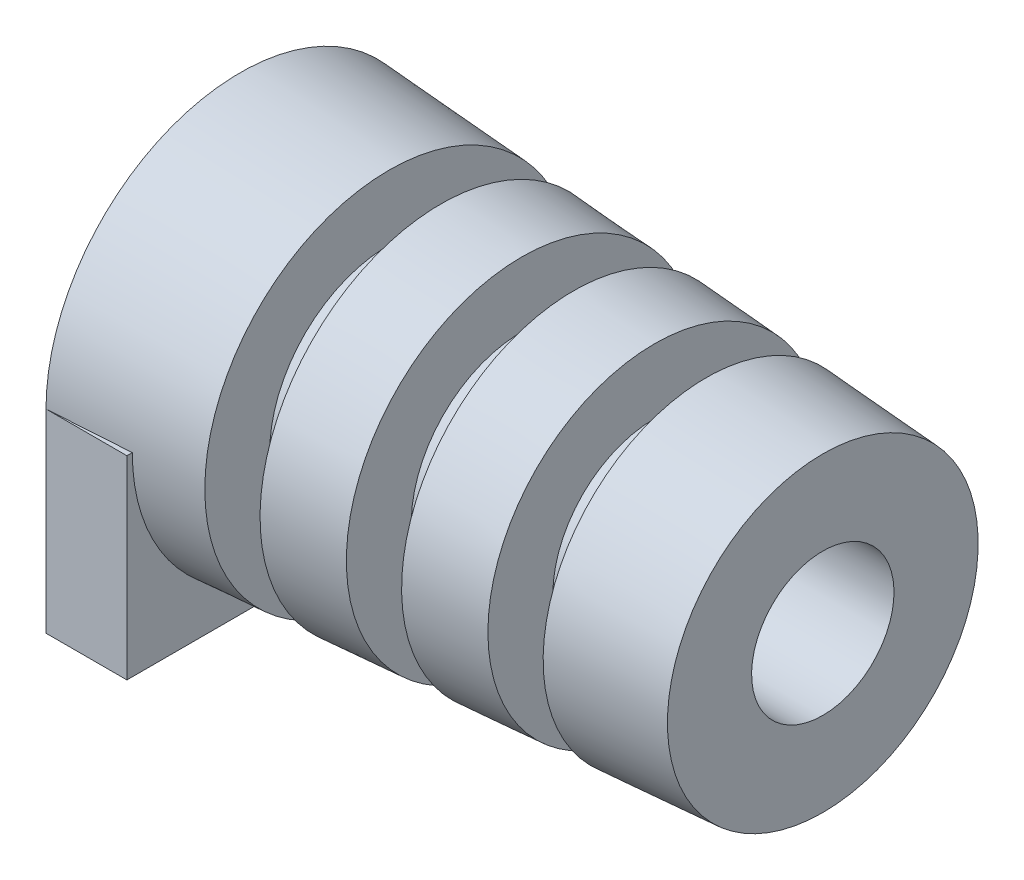
ISO-10303-21;
HEADER;
FILE_DESCRIPTION(('STEP AP214'),'2;1');
FILE_NAME('part.step','',(''),(''),'','','');
FILE_SCHEMA(('AUTOMOTIVE_DESIGN { 1 0 10303 214 1 1 1 1 }'));
ENDSEC;
DATA;
#1=APPLICATION_CONTEXT('core data for automotive mechanical design processes');
#2=APPLICATION_PROTOCOL_DEFINITION('international standard','automotive_design',2000,#1);
#3=PRODUCT_CONTEXT('',#1,'mechanical');
#4=PRODUCT('Part','Part','',(#3));
#5=PRODUCT_RELATED_PRODUCT_CATEGORY('part','',(#4));
#6=PRODUCT_DEFINITION_FORMATION('','',#4);
#7=PRODUCT_DEFINITION_CONTEXT('part definition',#1,'design');
#8=PRODUCT_DEFINITION('design','',#6,#7);
#9=PRODUCT_DEFINITION_SHAPE('','',#8);
#10=(LENGTH_UNIT() NAMED_UNIT(*) SI_UNIT(.MILLI.,.METRE.));
#11=(NAMED_UNIT(*) PLANE_ANGLE_UNIT() SI_UNIT($,.RADIAN.));
#12=(NAMED_UNIT(*) SI_UNIT($,.STERADIAN.) SOLID_ANGLE_UNIT());
#13=UNCERTAINTY_MEASURE_WITH_UNIT(LENGTH_MEASURE(1.E-05),#10,'distance_accuracy_value','');
#14=(GEOMETRIC_REPRESENTATION_CONTEXT(3) GLOBAL_UNCERTAINTY_ASSIGNED_CONTEXT((#13)) GLOBAL_UNIT_ASSIGNED_CONTEXT((#10,
#11,#12)) REPRESENTATION_CONTEXT('',''));
#15=CARTESIAN_POINT('',(0.,0.,0.));
#16=DIRECTION('',(0.,0.,1.));
#17=DIRECTION('',(1.,0.,0.));
#18=AXIS2_PLACEMENT_3D('',#15,#16,#17);
#19=CARTESIAN_POINT('',(6.10400233391438,-1.84629635361384,50.4016402272596));
#20=DIRECTION('',(1.,0.,0.));
#21=DIRECTION('',(0.,1.,0.));
#22=AXIS2_PLACEMENT_3D('',#19,#20,#21);
#23=PLANE('',#22);
#24=CARTESIAN_POINT('',(6.10400233391438,5.3842369797195,50.4016402272596));
#25=DIRECTION('',(-1.,0.,0.));
#26=DIRECTION('',(0.,-1.,0.));
#27=AXIS2_PLACEMENT_3D('',#24,#25,#26);
#28=CIRCLE('',#27,4.68508525098379);
#29=CARTESIAN_POINT('',(6.10400233391438,0.699151728735705,50.4016402272596));
#30=VERTEX_POINT('',#29);
#31=EDGE_CURVE('E221',#30,#30,#28,.T.);
#32=ORIENTED_EDGE('',*,*,#31,.T.);
#33=EDGE_LOOP('',(#32));
#34=FACE_BOUND('',#33,.T.);
#35=CARTESIAN_POINT('',(6.10400233391437,5.3842369797195,50.4016402272596));
#36=DIRECTION('',(-1.,0.,0.));
#37=DIRECTION('',(0.,-1.,0.));
#38=AXIS2_PLACEMENT_3D('',#35,#36,#37);
#39=CIRCLE('',#38,7.2307234377216);
#40=CARTESIAN_POINT('',(6.10400233391437,-1.84648645800211,50.4016402272596));
#41=VERTEX_POINT('',#40);
#42=EDGE_CURVE('E266',#41,#41,#39,.T.);
#43=ORIENTED_EDGE('',*,*,#42,.F.);
#44=EDGE_LOOP('',(#43));
#45=FACE_BOUND('',#44,.T.);
#46=ADVANCED_FACE('F38',(#34,#45),#23,.T.);
#47=CARTESIAN_POINT('',(6.10400233391437,5.3842369797195,50.4016402272596));
#48=DIRECTION('',(-1.,0.,0.));
#49=DIRECTION('',(0.,-1.,0.));
#50=AXIS2_PLACEMENT_3D('',#47,#48,#49);
#51=CONICAL_SURFACE('',#50,7.2307234377216,0.0665681637758238);
#52=CARTESIAN_POINT('',(3.43659593391437,5.3842369797195,50.4016402272596));
#53=DIRECTION('',(-1.,0.,0.));
#54=DIRECTION('',(0.,-1.,0.));
#55=AXIS2_PLACEMENT_3D('',#52,#53,#54);
#56=CIRCLE('',#55,7.40855053105494);
#57=CARTESIAN_POINT('',(3.43659593391437,5.3842369797195,42.9930896962047));
#58=VERTEX_POINT('',#57);
#59=CARTESIAN_POINT('',(3.43659593391437,5.3842369797195,57.8101907583146));
#60=VERTEX_POINT('',#59);
#61=EDGE_CURVE('E172',#58,#60,#56,.T.);
#62=ORIENTED_EDGE('',*,*,#61,.F.);
#63=DIRECTION('',(-0.997785157856609,0.,-0.0665190105237739));
#64=VECTOR('',#63,1.);
#65=CARTESIAN_POINT('',(114.564853899738,5.38423697971951,50.4016402272596));
#66=LINE('',#65,#64);
#67=CARTESIAN_POINT('',(0.261595933914373,5.3842369797195,42.7814230572596));
#68=VERTEX_POINT('',#67);
#69=EDGE_CURVE('E112',#58,#68,#66,.T.);
#70=ORIENTED_EDGE('',*,*,#69,.T.);
#71=CARTESIAN_POINT('',(0.261595933914374,5.3842369797195,50.4016402272596));
#72=DIRECTION('',(-1.,0.,0.));
#73=DIRECTION('',(0.,-1.,0.));
#74=AXIS2_PLACEMENT_3D('',#71,#72,#73);
#75=CIRCLE('',#74,7.6202171977216);
#76=CARTESIAN_POINT('',(0.261595933914373,5.3842369797195,58.0218573972596));
#77=VERTEX_POINT('',#76);
#78=EDGE_CURVE('E263',#77,#68,#75,.T.);
#79=ORIENTED_EDGE('',*,*,#78,.F.);
#80=DIRECTION('',(0.997785157856609,0.,-0.0665190105237739));
#81=VECTOR('',#80,1.);
#82=CARTESIAN_POINT('',(114.564853899738,5.38423697971947,50.4016402272596));
#83=LINE('',#82,#81);
#84=EDGE_CURVE('E167',#77,#60,#83,.T.);
#85=ORIENTED_EDGE('',*,*,#84,.T.);
#86=EDGE_LOOP('',(#62,#70,#79,#85));
#87=FACE_BOUND('',#86,.T.);
#88=ORIENTED_EDGE('',*,*,#42,.T.);
#89=EDGE_LOOP('',(#88));
#90=FACE_BOUND('',#89,.T.);
#91=ADVANCED_FACE('F373',(#87,#90),#51,.T.);
#92=CARTESIAN_POINT('',(0.261595933914373,-2.2357630202805,50.4016402272596));
#93=DIRECTION('',(1.,0.,0.));
#94=DIRECTION('',(0.,1.,0.));
#95=AXIS2_PLACEMENT_3D('',#92,#93,#94);
#96=PLANE('',#95);
#97=CARTESIAN_POINT('',(0.261595933914373,5.3842369797195,50.4016402272596));
#98=DIRECTION('',(-1.,0.,0.));
#99=DIRECTION('',(0.,-1.,0.));
#100=AXIS2_PLACEMENT_3D('',#97,#98,#99);
#101=CIRCLE('',#100,2.7937968);
#102=CARTESIAN_POINT('',(0.261595933914373,2.5904401797195,50.4016402272596));
#103=VERTEX_POINT('',#102);
#104=EDGE_CURVE('E260',#103,#103,#101,.T.);
#105=ORIENTED_EDGE('',*,*,#104,.F.);
#106=EDGE_LOOP('',(#105));
#107=FACE_BOUND('',#106,.T.);
#108=ORIENTED_EDGE('',*,*,#78,.T.);
#109=DIRECTION('',(0.,-1.,0.));
#110=VECTOR('',#109,1.);
#111=CARTESIAN_POINT('',(0.261595933914373,5.3842369797195,42.7814230572596));
#112=LINE('',#111,#110);
#113=CARTESIAN_POINT('',(0.261595933914373,-2.2359801902805,42.7814230572596));
#114=VERTEX_POINT('',#113);
#115=EDGE_CURVE('E125',#68,#114,#112,.T.);
#116=ORIENTED_EDGE('',*,*,#115,.T.);
#117=DIRECTION('',(0.,0.,1.));
#118=VECTOR('',#117,1.);
#119=CARTESIAN_POINT('',(0.261595933914373,-2.2359801902805,42.7814230572596));
#120=LINE('',#119,#118);
#121=CARTESIAN_POINT('',(0.261595933914373,-2.2359801902805,58.0218573972596));
#122=VERTEX_POINT('',#121);
#123=EDGE_CURVE('E148',#114,#122,#120,.T.);
#124=ORIENTED_EDGE('',*,*,#123,.T.);
#125=DIRECTION('',(0.,1.,0.));
#126=VECTOR('',#125,1.);
#127=CARTESIAN_POINT('',(0.261595933914373,5.3842369797195,58.0218573972596));
#128=LINE('',#127,#126);
#129=EDGE_CURVE('E117',#122,#77,#128,.T.);
#130=ORIENTED_EDGE('',*,*,#129,.T.);
#131=EDGE_LOOP('',(#108,#116,#124,#130));
#132=FACE_BOUND('',#131,.T.);
#133=ADVANCED_FACE('F370',(#107,#132),#96,.F.);
#134=CARTESIAN_POINT('',(0.261799133914373,5.3842369797195,50.4016402272596));
#135=DIRECTION('',(-1.,0.,0.));
#136=DIRECTION('',(0.,-1.,0.));
#137=AXIS2_PLACEMENT_3D('',#134,#135,#136);
#138=CYLINDRICAL_SURFACE('',#137,2.7937968);
#139=CARTESIAN_POINT('',(23.1220023339144,5.3842369797195,50.4016402272596));
#140=DIRECTION('',(-1.,0.,0.));
#141=DIRECTION('',(0.,-1.,0.));
#142=AXIS2_PLACEMENT_3D('',#139,#140,#141);
#143=CIRCLE('',#142,2.7937968);
#144=CARTESIAN_POINT('',(23.1220023339144,2.5904401797195,50.4016402272596));
#145=VERTEX_POINT('',#144);
#146=EDGE_CURVE('E257',#145,#145,#143,.T.);
#147=ORIENTED_EDGE('',*,*,#146,.F.);
#148=EDGE_LOOP('',(#147));
#149=FACE_BOUND('',#148,.T.);
#150=ORIENTED_EDGE('',*,*,#104,.T.);
#151=EDGE_LOOP('',(#150));
#152=FACE_BOUND('',#151,.T.);
#153=ADVANCED_FACE('F366',(#149,#152),#138,.F.);
#154=CARTESIAN_POINT('',(23.1220023339144,2.5902369797195,50.4016402272596));
#155=DIRECTION('',(-1.,0.,0.));
#156=DIRECTION('',(0.,-1.,0.));
#157=AXIS2_PLACEMENT_3D('',#154,#155,#156);
#158=PLANE('',#157);
#159=CARTESIAN_POINT('',(23.1220023339144,5.3842369797195,50.4016402272596));
#160=DIRECTION('',(-1.,0.,0.));
#161=DIRECTION('',(0.,-1.,0.));
#162=AXIS2_PLACEMENT_3D('',#159,#160,#161);
#163=CIRCLE('',#162,6.09619010438827);
#164=CARTESIAN_POINT('',(23.1220023339144,-0.711953124668777,50.4016402272596));
#165=VERTEX_POINT('',#164);
#166=EDGE_CURVE('E254',#165,#165,#163,.T.);
#167=ORIENTED_EDGE('',*,*,#166,.F.);
#168=EDGE_LOOP('',(#167));
#169=FACE_BOUND('',#168,.T.);
#170=ORIENTED_EDGE('',*,*,#146,.T.);
#171=EDGE_LOOP('',(#170));
#172=FACE_BOUND('',#171,.T.);
#173=ADVANCED_FACE('F362',(#169,#172),#158,.F.);
#174=CARTESIAN_POINT('',(23.1220023339144,5.3842369797195,50.4016402272596));
#175=DIRECTION('',(-1.,0.,0.));
#176=DIRECTION('',(0.,-1.,0.));
#177=AXIS2_PLACEMENT_3D('',#174,#175,#176);
#178=CONICAL_SURFACE('',#177,6.09619010438827,0.0665681637758238);
#179=CARTESIAN_POINT('',(18.5495959339144,5.3842369797195,50.4016402272596));
#180=DIRECTION('',(-1.,0.,0.));
#181=DIRECTION('',(0.,-1.,0.));
#182=AXIS2_PLACEMENT_3D('',#179,#180,#181);
#183=CIRCLE('',#182,6.40101719772161);
#184=CARTESIAN_POINT('',(18.5495959339144,-1.01678021800211,50.4016402272596));
#185=VERTEX_POINT('',#184);
#186=EDGE_CURVE('E251',#185,#185,#183,.T.);
#187=ORIENTED_EDGE('',*,*,#186,.F.);
#188=EDGE_LOOP('',(#187));
#189=FACE_BOUND('',#188,.T.);
#190=ORIENTED_EDGE('',*,*,#166,.T.);
#191=EDGE_LOOP('',(#190));
#192=FACE_BOUND('',#191,.T.);
#193=ADVANCED_FACE('F358',(#189,#192),#178,.T.);
#194=CARTESIAN_POINT('',(18.5495959339144,-1.0165630202805,50.4016402272596));
#195=DIRECTION('',(1.,0.,0.));
#196=DIRECTION('',(0.,1.,0.));
#197=AXIS2_PLACEMENT_3D('',#194,#195,#196);
#198=PLANE('',#197);
#199=CARTESIAN_POINT('',(18.5495959339144,5.3842369797195,50.4016402272596));
#200=DIRECTION('',(-1.,0.,0.));
#201=DIRECTION('',(0.,-1.,0.));
#202=AXIS2_PLACEMENT_3D('',#199,#200,#201);
#203=CIRCLE('',#202,3.85537901098379);
#204=CARTESIAN_POINT('',(18.5495959339144,1.5288579687357,50.4016402272596));
#205=VERTEX_POINT('',#204);
#206=EDGE_CURVE('E248',#205,#205,#203,.T.);
#207=ORIENTED_EDGE('',*,*,#206,.F.);
#208=EDGE_LOOP('',(#207));
#209=FACE_BOUND('',#208,.T.);
#210=ORIENTED_EDGE('',*,*,#186,.T.);
#211=EDGE_LOOP('',(#210));
#212=FACE_BOUND('',#211,.T.);
#213=ADVANCED_FACE('F354',(#209,#212),#198,.F.);
#214=CARTESIAN_POINT('',(18.5495959339144,5.3842369797195,50.4016402272596));
#215=DIRECTION('',(-1.,0.,0.));
#216=DIRECTION('',(0.,-1.,0.));
#217=AXIS2_PLACEMENT_3D('',#214,#215,#216);
#218=CONICAL_SURFACE('',#217,3.85537901098379,0.0665681637758238);
#219=CARTESIAN_POINT('',(16.5180023339144,5.3842369797195,50.4016402272596));
#220=DIRECTION('',(-1.,0.,0.));
#221=DIRECTION('',(0.,-1.,0.));
#222=AXIS2_PLACEMENT_3D('',#219,#220,#221);
#223=CIRCLE('',#222,3.99081858431713);
#224=CARTESIAN_POINT('',(16.5180023339144,1.39341839540237,50.4016402272596));
#225=VERTEX_POINT('',#224);
#226=EDGE_CURVE('E245',#225,#225,#223,.T.);
#227=ORIENTED_EDGE('',*,*,#226,.F.);
#228=EDGE_LOOP('',(#227));
#229=FACE_BOUND('',#228,.T.);
#230=ORIENTED_EDGE('',*,*,#206,.T.);
#231=EDGE_LOOP('',(#230));
#232=FACE_BOUND('',#231,.T.);
#233=ADVANCED_FACE('F350',(#229,#232),#218,.T.);
#234=CARTESIAN_POINT('',(16.5180023339144,-1.15202968694717,50.4016402272596));
#235=DIRECTION('',(1.,0.,0.));
#236=DIRECTION('',(0.,1.,0.));
#237=AXIS2_PLACEMENT_3D('',#234,#235,#236);
#238=PLANE('',#237);
#239=ORIENTED_EDGE('',*,*,#226,.T.);
#240=EDGE_LOOP('',(#239));
#241=FACE_BOUND('',#240,.T.);
#242=CARTESIAN_POINT('',(16.5180023339144,5.3842369797195,50.4016402272596));
#243=DIRECTION('',(-1.,0.,0.));
#244=DIRECTION('',(0.,-1.,0.));
#245=AXIS2_PLACEMENT_3D('',#242,#243,#244);
#246=CIRCLE('',#245,6.53645677105494);
#247=CARTESIAN_POINT('',(16.5180023339144,-1.15221979133544,50.4016402272596));
#248=VERTEX_POINT('',#247);
#249=EDGE_CURVE('E242',#248,#248,#246,.T.);
#250=ORIENTED_EDGE('',*,*,#249,.F.);
#251=EDGE_LOOP('',(#250));
#252=FACE_BOUND('',#251,.T.);
#253=ADVANCED_FACE('F346',(#241,#252),#238,.T.);
#254=CARTESIAN_POINT('',(16.5180023339144,5.3842369797195,50.4016402272596));
#255=DIRECTION('',(-1.,0.,0.));
#256=DIRECTION('',(0.,-1.,0.));
#257=AXIS2_PLACEMENT_3D('',#254,#255,#256);
#258=CONICAL_SURFACE('',#257,6.53645677105494,0.0665681637758237);
#259=CARTESIAN_POINT('',(13.3425959339144,5.3842369797195,50.4016402272596));
#260=DIRECTION('',(-1.,0.,0.));
#261=DIRECTION('',(0.,-1.,0.));
#262=AXIS2_PLACEMENT_3D('',#259,#260,#261);
#263=CIRCLE('',#262,6.74815053105494);
#264=CARTESIAN_POINT('',(13.3425959339144,-1.36391355133544,50.4016402272596));
#265=VERTEX_POINT('',#264);
#266=EDGE_CURVE('E239',#265,#265,#263,.T.);
#267=ORIENTED_EDGE('',*,*,#266,.F.);
#268=EDGE_LOOP('',(#267));
#269=FACE_BOUND('',#268,.T.);
#270=ORIENTED_EDGE('',*,*,#249,.T.);
#271=EDGE_LOOP('',(#270));
#272=FACE_BOUND('',#271,.T.);
#273=ADVANCED_FACE('F342',(#269,#272),#258,.T.);
#274=CARTESIAN_POINT('',(13.3425959339144,-1.36369635361384,50.4016402272596));
#275=DIRECTION('',(1.,0.,0.));
#276=DIRECTION('',(0.,1.,0.));
#277=AXIS2_PLACEMENT_3D('',#274,#275,#276);
#278=PLANE('',#277);
#279=CARTESIAN_POINT('',(13.3425959339144,5.3842369797195,50.4016402272596));
#280=DIRECTION('',(-1.,0.,0.));
#281=DIRECTION('',(0.,-1.,0.));
#282=AXIS2_PLACEMENT_3D('',#279,#280,#281);
#283=CIRCLE('',#282,4.20251234431713);
#284=CARTESIAN_POINT('',(13.3425959339144,1.18172463540237,50.4016402272596));
#285=VERTEX_POINT('',#284);
#286=EDGE_CURVE('E236',#285,#285,#283,.T.);
#287=ORIENTED_EDGE('',*,*,#286,.F.);
#288=EDGE_LOOP('',(#287));
#289=FACE_BOUND('',#288,.T.);
#290=ORIENTED_EDGE('',*,*,#266,.T.);
#291=EDGE_LOOP('',(#290));
#292=FACE_BOUND('',#291,.T.);
#293=ADVANCED_FACE('F338',(#289,#292),#278,.F.);
#294=CARTESIAN_POINT('',(13.3425959339144,5.3842369797195,50.4016402272596));
#295=DIRECTION('',(-1.,0.,0.));
#296=DIRECTION('',(0.,-1.,0.));
#297=AXIS2_PLACEMENT_3D('',#294,#295,#296);
#298=CONICAL_SURFACE('',#297,4.20251234431713,0.0665681637758247);
#299=CARTESIAN_POINT('',(11.3110023339144,5.3842369797195,50.4016402272596));
#300=DIRECTION('',(-1.,0.,0.));
#301=DIRECTION('',(0.,-1.,0.));
#302=AXIS2_PLACEMENT_3D('',#299,#300,#301);
#303=CIRCLE('',#302,4.33795191765046);
#304=CARTESIAN_POINT('',(11.3110023339144,1.04628506206904,50.4016402272596));
#305=VERTEX_POINT('',#304);
#306=EDGE_CURVE('E233',#305,#305,#303,.T.);
#307=ORIENTED_EDGE('',*,*,#306,.F.);
#308=EDGE_LOOP('',(#307));
#309=FACE_BOUND('',#308,.T.);
#310=ORIENTED_EDGE('',*,*,#286,.T.);
#311=EDGE_LOOP('',(#310));
#312=FACE_BOUND('',#311,.T.);
#313=ADVANCED_FACE('F334',(#309,#312),#298,.T.);
#314=CARTESIAN_POINT('',(11.3110023339144,-1.4991630202805,50.4016402272596));
#315=DIRECTION('',(1.,0.,0.));
#316=DIRECTION('',(0.,1.,0.));
#317=AXIS2_PLACEMENT_3D('',#314,#315,#316);
#318=PLANE('',#317);
#319=ORIENTED_EDGE('',*,*,#306,.T.);
#320=EDGE_LOOP('',(#319));
#321=FACE_BOUND('',#320,.T.);
#322=CARTESIAN_POINT('',(11.3110023339144,5.3842369797195,50.4016402272596));
#323=DIRECTION('',(-1.,0.,0.));
#324=DIRECTION('',(0.,-1.,0.));
#325=AXIS2_PLACEMENT_3D('',#322,#323,#324);
#326=CIRCLE('',#325,6.88359010438827);
#327=CARTESIAN_POINT('',(11.3110023339144,-1.49935312466878,50.4016402272596));
#328=VERTEX_POINT('',#327);
#329=EDGE_CURVE('E230',#328,#328,#326,.T.);
#330=ORIENTED_EDGE('',*,*,#329,.F.);
#331=EDGE_LOOP('',(#330));
#332=FACE_BOUND('',#331,.T.);
#333=ADVANCED_FACE('F330',(#321,#332),#318,.T.);
#334=CARTESIAN_POINT('',(11.3110023339144,5.3842369797195,50.4016402272596));
#335=DIRECTION('',(-1.,0.,0.));
#336=DIRECTION('',(0.,-1.,0.));
#337=AXIS2_PLACEMENT_3D('',#334,#335,#336);
#338=CONICAL_SURFACE('',#337,6.88359010438827,0.0665681637758237);
#339=CARTESIAN_POINT('',(8.13559593391437,5.3842369797195,50.4016402272596));
#340=DIRECTION('',(-1.,0.,0.));
#341=DIRECTION('',(0.,-1.,0.));
#342=AXIS2_PLACEMENT_3D('',#339,#340,#341);
#343=CIRCLE('',#342,7.09528386438827);
#344=CARTESIAN_POINT('',(8.13559593391437,-1.71104688466878,50.4016402272596));
#345=VERTEX_POINT('',#344);
#346=EDGE_CURVE('E227',#345,#345,#343,.T.);
#347=ORIENTED_EDGE('',*,*,#346,.F.);
#348=EDGE_LOOP('',(#347));
#349=FACE_BOUND('',#348,.T.);
#350=ORIENTED_EDGE('',*,*,#329,.T.);
#351=EDGE_LOOP('',(#350));
#352=FACE_BOUND('',#351,.T.);
#353=ADVANCED_FACE('F326',(#349,#352),#338,.T.);
#354=CARTESIAN_POINT('',(8.13559593391437,-1.71082968694717,50.4016402272596));
#355=DIRECTION('',(1.,0.,0.));
#356=DIRECTION('',(0.,1.,0.));
#357=AXIS2_PLACEMENT_3D('',#354,#355,#356);
#358=PLANE('',#357);
#359=CARTESIAN_POINT('',(8.13559593391437,5.3842369797195,50.4016402272596));
#360=DIRECTION('',(-1.,0.,0.));
#361=DIRECTION('',(0.,-1.,0.));
#362=AXIS2_PLACEMENT_3D('',#359,#360,#361);
#363=CIRCLE('',#362,4.54964567765046);
#364=CARTESIAN_POINT('',(8.13559593391437,0.834591302069037,50.4016402272596));
#365=VERTEX_POINT('',#364);
#366=EDGE_CURVE('E224',#365,#365,#363,.T.);
#367=ORIENTED_EDGE('',*,*,#366,.F.);
#368=EDGE_LOOP('',(#367));
#369=FACE_BOUND('',#368,.T.);
#370=ORIENTED_EDGE('',*,*,#346,.T.);
#371=EDGE_LOOP('',(#370));
#372=FACE_BOUND('',#371,.T.);
#373=ADVANCED_FACE('F322',(#369,#372),#358,.F.);
#374=CARTESIAN_POINT('',(8.13559593391437,5.3842369797195,50.4016402272596));
#375=DIRECTION('',(-1.,0.,0.));
#376=DIRECTION('',(0.,-1.,0.));
#377=AXIS2_PLACEMENT_3D('',#374,#375,#376);
#378=CONICAL_SURFACE('',#377,4.54964567765046,0.0665681637758236);
#379=ORIENTED_EDGE('',*,*,#31,.F.);
#380=EDGE_LOOP('',(#379));
#381=FACE_BOUND('',#380,.T.);
#382=ORIENTED_EDGE('',*,*,#366,.T.);
#383=EDGE_LOOP('',(#382));
#384=FACE_BOUND('',#383,.T.);
#385=ADVANCED_FACE('F320',(#381,#384),#378,.T.);
#386=CARTESIAN_POINT('',(3.43659593391437,5.3842369797195,50.4016402272596));
#387=DIRECTION('',(-1.,0.,0.));
#388=DIRECTION('',(0.,-1.,0.));
#389=AXIS2_PLACEMENT_3D('',#386,#387,#388);
#390=PLANE('',#389);
#391=DIRECTION('',(0.,0.,-1.));
#392=VECTOR('',#391,1.);
#393=CARTESIAN_POINT('',(3.43659593391437,5.3842369797195,43.2896402272596));
#394=LINE('',#393,#392);
#395=CARTESIAN_POINT('',(3.43659593391437,5.3842369797195,42.7814230572596));
#396=VERTEX_POINT('',#395);
#397=EDGE_CURVE('E106',#58,#396,#394,.T.);
#398=ORIENTED_EDGE('',*,*,#397,.F.);
#399=ORIENTED_EDGE('',*,*,#61,.T.);
#400=DIRECTION('',(0.,0.,-1.));
#401=VECTOR('',#400,1.);
#402=CARTESIAN_POINT('',(3.43659593391437,5.3842369797195,57.5136402272596));
#403=LINE('',#402,#401);
#404=CARTESIAN_POINT('',(3.43659593391437,5.3842369797195,58.0218573972596));
#405=VERTEX_POINT('',#404);
#406=EDGE_CURVE('E142',#405,#60,#403,.T.);
#407=ORIENTED_EDGE('',*,*,#406,.F.);
#408=DIRECTION('',(0.,1.,0.));
#409=VECTOR('',#408,1.);
#410=CARTESIAN_POINT('',(3.43659593391437,5.3842369797195,58.0218573972596));
#411=LINE('',#410,#409);
#412=CARTESIAN_POINT('',(3.43659593391437,-2.2359801902805,58.0218573972596));
#413=VERTEX_POINT('',#412);
#414=EDGE_CURVE('E135',#413,#405,#411,.T.);
#415=ORIENTED_EDGE('',*,*,#414,.F.);
#416=DIRECTION('',(0.,0.,1.));
#417=VECTOR('',#416,1.);
#418=CARTESIAN_POINT('',(3.43659593391437,-2.2359801902805,42.7814230572596));
#419=LINE('',#418,#417);
#420=CARTESIAN_POINT('',(3.43659593391437,-2.2359801902805,42.7814230572596));
#421=VERTEX_POINT('',#420);
#422=EDGE_CURVE('E133',#421,#413,#419,.T.);
#423=ORIENTED_EDGE('',*,*,#422,.F.);
#424=DIRECTION('',(0.,-1.,0.));
#425=VECTOR('',#424,1.);
#426=CARTESIAN_POINT('',(3.43659593391437,5.3842369797195,42.7814230572596));
#427=LINE('',#426,#425);
#428=EDGE_CURVE('E123',#396,#421,#427,.T.);
#429=ORIENTED_EDGE('',*,*,#428,.F.);
#430=EDGE_LOOP('',(#398,#399,#407,#415,#423,#429));
#431=FACE_BOUND('',#430,.T.);
#432=ADVANCED_FACE('F130',(#431),#390,.F.);
#433=CARTESIAN_POINT('',(3.43659593391437,5.3842369797195,43.2896402272596));
#434=DIRECTION('',(0.,1.,0.));
#435=DIRECTION('',(0.,0.,1.));
#436=AXIS2_PLACEMENT_3D('',#433,#434,#435);
#437=PLANE('',#436);
#438=ORIENTED_EDGE('',*,*,#69,.F.);
#439=ORIENTED_EDGE('',*,*,#397,.T.);
#440=DIRECTION('',(-1.,0.,0.));
#441=VECTOR('',#440,1.);
#442=CARTESIAN_POINT('',(3.43659593391437,5.3842369797195,42.7814230572596));
#443=LINE('',#442,#441);
#444=EDGE_CURVE('E109',#396,#68,#443,.T.);
#445=ORIENTED_EDGE('',*,*,#444,.T.);
#446=EDGE_LOOP('',(#438,#439,#445));
#447=FACE_BOUND('',#446,.T.);
#448=ADVANCED_FACE('F108',(#447),#437,.T.);
#449=CARTESIAN_POINT('',(3.43659593391437,5.3842369797195,57.5136402272596));
#450=DIRECTION('',(0.,1.,0.));
#451=DIRECTION('',(0.,0.,1.));
#452=AXIS2_PLACEMENT_3D('',#449,#450,#451);
#453=PLANE('',#452);
#454=ORIENTED_EDGE('',*,*,#84,.F.);
#455=DIRECTION('',(-1.,0.,0.));
#456=VECTOR('',#455,1.);
#457=CARTESIAN_POINT('',(3.43659593391437,5.3842369797195,58.0218573972596));
#458=LINE('',#457,#456);
#459=EDGE_CURVE('E159',#405,#77,#458,.T.);
#460=ORIENTED_EDGE('',*,*,#459,.F.);
#461=ORIENTED_EDGE('',*,*,#406,.T.);
#462=EDGE_LOOP('',(#454,#460,#461));
#463=FACE_BOUND('',#462,.T.);
#464=ADVANCED_FACE('F388',(#463),#453,.T.);
#465=CARTESIAN_POINT('',(3.43659593391437,5.3842369797195,58.0218573972596));
#466=DIRECTION('',(0.,0.,1.));
#467=DIRECTION('',(1.,0.,0.));
#468=AXIS2_PLACEMENT_3D('',#465,#466,#467);
#469=PLANE('',#468);
#470=ORIENTED_EDGE('',*,*,#129,.F.);
#471=DIRECTION('',(-1.,0.,0.));
#472=VECTOR('',#471,1.);
#473=CARTESIAN_POINT('',(3.43659593391437,-2.2359801902805,58.0218573972596));
#474=LINE('',#473,#472);
#475=EDGE_CURVE('E162',#413,#122,#474,.T.);
#476=ORIENTED_EDGE('',*,*,#475,.F.);
#477=ORIENTED_EDGE('',*,*,#414,.T.);
#478=ORIENTED_EDGE('',*,*,#459,.T.);
#479=EDGE_LOOP('',(#470,#476,#477,#478));
#480=FACE_BOUND('',#479,.T.);
#481=ADVANCED_FACE('F391',(#480),#469,.T.);
#482=CARTESIAN_POINT('',(3.43659593391437,-2.2359801902805,42.7814230572596));
#483=DIRECTION('',(0.,-1.,0.));
#484=DIRECTION('',(0.,0.,-1.));
#485=AXIS2_PLACEMENT_3D('',#482,#483,#484);
#486=PLANE('',#485);
#487=ORIENTED_EDGE('',*,*,#123,.F.);
#488=DIRECTION('',(-1.,0.,0.));
#489=VECTOR('',#488,1.);
#490=CARTESIAN_POINT('',(3.43659593391437,-2.2359801902805,42.7814230572596));
#491=LINE('',#490,#489);
#492=EDGE_CURVE('E126',#421,#114,#491,.T.);
#493=ORIENTED_EDGE('',*,*,#492,.F.);
#494=ORIENTED_EDGE('',*,*,#422,.T.);
#495=ORIENTED_EDGE('',*,*,#475,.T.);
#496=EDGE_LOOP('',(#487,#493,#494,#495));
#497=FACE_BOUND('',#496,.T.);
#498=ADVANCED_FACE('F394',(#497),#486,.T.);
#499=CARTESIAN_POINT('',(3.43659593391437,5.3842369797195,42.7814230572596));
#500=DIRECTION('',(0.,0.,-1.));
#501=DIRECTION('',(-1.,0.,0.));
#502=AXIS2_PLACEMENT_3D('',#499,#500,#501);
#503=PLANE('',#502);
#504=ORIENTED_EDGE('',*,*,#115,.F.);
#505=ORIENTED_EDGE('',*,*,#444,.F.);
#506=ORIENTED_EDGE('',*,*,#428,.T.);
#507=ORIENTED_EDGE('',*,*,#492,.T.);
#508=EDGE_LOOP('',(#504,#505,#506,#507));
#509=FACE_BOUND('',#508,.T.);
#510=ADVANCED_FACE('F121',(#509),#503,.T.);
#511=CLOSED_SHELL('',(#46,#91,#133,#153,#173,#193,#213,#233,#253,#273,#293,#313,#333,#353,#373,
#385,#432,#448,#464,#481,#498,#510));
#512=CARTESIAN_POINT('',(6.10379913391438,-1.84629635361384,50.4016402272596));
#513=DIRECTION('',(1.,0.,0.));
#514=DIRECTION('',(0.,1.,0.));
#515=AXIS2_PLACEMENT_3D('',#512,#513,#514);
#516=PLANE('',#515);
#517=CARTESIAN_POINT('',(6.10379913391438,5.3842369797195,50.4016402272596));
#518=DIRECTION('',(-1.,0.,0.));
#519=DIRECTION('',(0.,-1.,0.));
#520=AXIS2_PLACEMENT_3D('',#517,#518,#519);
#521=CIRCLE('',#520,4.68489514659552);
#522=CARTESIAN_POINT('',(6.10379913391438,0.699341833123977,50.4016402272596));
#523=VERTEX_POINT('',#522);
#524=EDGE_CURVE('E174',#523,#523,#521,.T.);
#525=ORIENTED_EDGE('',*,*,#524,.F.);
#526=EDGE_LOOP('',(#525));
#527=FACE_BOUND('',#526,.T.);
#528=CARTESIAN_POINT('',(6.10379913391437,5.3842369797195,50.4016402272596));
#529=DIRECTION('',(-1.,0.,0.));
#530=DIRECTION('',(0.,-1.,0.));
#531=AXIS2_PLACEMENT_3D('',#528,#529,#530);
#532=CIRCLE('',#531,7.23053333333333);
#533=CARTESIAN_POINT('',(6.10379913391437,-1.84629635361384,50.4016402272596));
#534=VERTEX_POINT('',#533);
#535=EDGE_CURVE('E218',#534,#534,#532,.T.);
#536=ORIENTED_EDGE('',*,*,#535,.T.);
#537=EDGE_LOOP('',(#536));
#538=FACE_BOUND('',#537,.T.);
#539=ADVANCED_FACE('F309',(#527,#538),#516,.F.);
#540=CARTESIAN_POINT('',(6.10379913391437,5.3842369797195,50.4016402272596));
#541=DIRECTION('',(-1.,0.,0.));
#542=DIRECTION('',(0.,-1.,0.));
#543=AXIS2_PLACEMENT_3D('',#540,#541,#542);
#544=CONICAL_SURFACE('',#543,7.23053333333333,0.0665681637758238);
#545=DIRECTION('',(-0.997785157856609,0.,-0.066519010523774));
#546=VECTOR('',#545,1.);
#547=CARTESIAN_POINT('',(114.561799133914,5.38423697971951,50.4016402272596));
#548=LINE('',#547,#546);
#549=CARTESIAN_POINT('',(3.43659593391437,5.3842369797195,42.9932933472596));
#550=VERTEX_POINT('',#549);
#551=CARTESIAN_POINT('',(0.261799133914374,5.3842369797195,42.7816402272596));
#552=VERTEX_POINT('',#551);
#553=EDGE_CURVE('E56',#550,#552,#548,.T.);
#554=ORIENTED_EDGE('',*,*,#553,.F.);
#555=CARTESIAN_POINT('',(3.43659593391437,5.3842369797195,50.4016402272596));
#556=DIRECTION('',(-1.,0.,0.));
#557=DIRECTION('',(0.,-1.,0.));
#558=AXIS2_PLACEMENT_3D('',#555,#556,#557);
#559=CIRCLE('',#558,7.40834688);
#560=CARTESIAN_POINT('',(3.43659593391437,5.3842369797195,57.8099871072596));
#561=VERTEX_POINT('',#560);
#562=EDGE_CURVE('E11',#550,#561,#559,.T.);
#563=ORIENTED_EDGE('',*,*,#562,.T.);
#564=DIRECTION('',(0.997785157856609,0.,-0.066519010523774));
#565=VECTOR('',#564,1.);
#566=CARTESIAN_POINT('',(114.561799133914,5.38423697971947,50.4016402272596));
#567=LINE('',#566,#565);
#568=CARTESIAN_POINT('',(0.261799133914373,5.3842369797195,58.0216402272596));
#569=VERTEX_POINT('',#568);
#570=EDGE_CURVE('E155',#569,#561,#567,.T.);
#571=ORIENTED_EDGE('',*,*,#570,.F.);
#572=CARTESIAN_POINT('',(0.261799133914374,5.3842369797195,50.4016402272596));
#573=DIRECTION('',(-1.,0.,0.));
#574=DIRECTION('',(0.,-1.,0.));
#575=AXIS2_PLACEMENT_3D('',#572,#573,#574);
#576=CIRCLE('',#575,7.62);
#577=EDGE_CURVE('E216',#569,#552,#576,.T.);
#578=ORIENTED_EDGE('',*,*,#577,.T.);
#579=EDGE_LOOP('',(#554,#563,#571,#578));
#580=FACE_BOUND('',#579,.T.);
#581=ORIENTED_EDGE('',*,*,#535,.F.);
#582=EDGE_LOOP('',(#581));
#583=FACE_BOUND('',#582,.T.);
#584=ADVANCED_FACE('F288',(#580,#583),#544,.F.);
#585=CARTESIAN_POINT('',(0.261799133914372,-2.2357630202805,50.4016402272596));
#586=DIRECTION('',(1.,0.,0.));
#587=DIRECTION('',(0.,1.,0.));
#588=AXIS2_PLACEMENT_3D('',#585,#586,#587);
#589=PLANE('',#588);
#590=DIRECTION('',(0.,0.,1.));
#591=VECTOR('',#590,1.);
#592=CARTESIAN_POINT('',(0.261799133914373,5.38423697971952,50.4016402272596));
#593=LINE('',#592,#591);
#594=CARTESIAN_POINT('',(0.261799133914373,5.3842369797195,43.2896402272596));
#595=VERTEX_POINT('',#594);
#596=EDGE_CURVE('E46',#552,#595,#593,.T.);
#597=ORIENTED_EDGE('',*,*,#596,.F.);
#598=ORIENTED_EDGE('',*,*,#577,.F.);
#599=DIRECTION('',(0.,0.,1.));
#600=VECTOR('',#599,1.);
#601=CARTESIAN_POINT('',(0.261799133914373,5.38423697971949,50.4016402272596));
#602=LINE('',#601,#600);
#603=CARTESIAN_POINT('',(0.261799133914373,5.3842369797195,57.5136402272596));
#604=VERTEX_POINT('',#603);
#605=EDGE_CURVE('E269',#604,#569,#602,.T.);
#606=ORIENTED_EDGE('',*,*,#605,.F.);
#607=CARTESIAN_POINT('',(0.261799133914373,5.3842369797195,50.4016402272596));
#608=DIRECTION('',(1.,0.,0.));
#609=DIRECTION('',(0.,1.,0.));
#610=AXIS2_PLACEMENT_3D('',#607,#608,#609);
#611=CIRCLE('',#610,7.112);
#612=EDGE_CURVE('E272',#595,#604,#611,.F.);
#613=ORIENTED_EDGE('',*,*,#612,.F.);
#614=EDGE_LOOP('',(#597,#598,#606,#613));
#615=FACE_BOUND('',#614,.T.);
#616=CARTESIAN_POINT('',(0.261799133914373,5.3842369797195,50.4016402272596));
#617=DIRECTION('',(-1.,0.,0.));
#618=DIRECTION('',(0.,-1.,0.));
#619=AXIS2_PLACEMENT_3D('',#616,#617,#618);
#620=CIRCLE('',#619,2.794);
#621=CARTESIAN_POINT('',(0.261799133914373,2.5902369797195,50.4016402272596));
#622=VERTEX_POINT('',#621);
#623=EDGE_CURVE('E213',#622,#622,#620,.T.);
#624=ORIENTED_EDGE('',*,*,#623,.T.);
#625=EDGE_LOOP('',(#624));
#626=FACE_BOUND('',#625,.T.);
#627=ADVANCED_FACE('F290',(#615,#626),#589,.T.);
#628=CARTESIAN_POINT('',(0.261799133914373,5.3842369797195,50.4016402272596));
#629=DIRECTION('',(-1.,0.,0.));
#630=DIRECTION('',(0.,-1.,0.));
#631=AXIS2_PLACEMENT_3D('',#628,#629,#630);
#632=CYLINDRICAL_SURFACE('',#631,2.794);
#633=CARTESIAN_POINT('',(23.1217991339144,5.3842369797195,50.4016402272596));
#634=DIRECTION('',(-1.,0.,0.));
#635=DIRECTION('',(0.,-1.,0.));
#636=AXIS2_PLACEMENT_3D('',#633,#634,#635);
#637=CIRCLE('',#636,2.794);
#638=CARTESIAN_POINT('',(23.1217991339144,2.5902369797195,50.4016402272596));
#639=VERTEX_POINT('',#638);
#640=EDGE_CURVE('E210',#639,#639,#637,.T.);
#641=ORIENTED_EDGE('',*,*,#640,.T.);
#642=EDGE_LOOP('',(#641));
#643=FACE_BOUND('',#642,.T.);
#644=ORIENTED_EDGE('',*,*,#623,.F.);
#645=EDGE_LOOP('',(#644));
#646=FACE_BOUND('',#645,.T.);
#647=ADVANCED_FACE('F293',(#643,#646),#632,.T.);
#648=CARTESIAN_POINT('',(23.1217991339144,2.5902369797195,50.4016402272596));
#649=DIRECTION('',(-1.,0.,0.));
#650=DIRECTION('',(0.,-1.,0.));
#651=AXIS2_PLACEMENT_3D('',#648,#649,#650);
#652=PLANE('',#651);
#653=CARTESIAN_POINT('',(23.1217991339144,5.3842369797195,50.4016402272596));
#654=DIRECTION('',(-1.,0.,0.));
#655=DIRECTION('',(0.,-1.,0.));
#656=AXIS2_PLACEMENT_3D('',#653,#654,#655);
#657=CIRCLE('',#656,6.096);
#658=CARTESIAN_POINT('',(23.1217991339144,-0.711763020280505,50.4016402272596));
#659=VERTEX_POINT('',#658);
#660=EDGE_CURVE('E207',#659,#659,#657,.T.);
#661=ORIENTED_EDGE('',*,*,#660,.T.);
#662=EDGE_LOOP('',(#661));
#663=FACE_BOUND('',#662,.T.);
#664=ORIENTED_EDGE('',*,*,#640,.F.);
#665=EDGE_LOOP('',(#664));
#666=FACE_BOUND('',#665,.T.);
#667=ADVANCED_FACE('F299',(#663,#666),#652,.T.);
#668=CARTESIAN_POINT('',(23.1217991339144,5.3842369797195,50.4016402272596));
#669=DIRECTION('',(-1.,0.,0.));
#670=DIRECTION('',(0.,-1.,0.));
#671=AXIS2_PLACEMENT_3D('',#668,#669,#670);
#672=CONICAL_SURFACE('',#671,6.096,0.0665681637758239);
#673=CARTESIAN_POINT('',(18.5497991339144,5.3842369797195,50.4016402272596));
#674=DIRECTION('',(-1.,0.,0.));
#675=DIRECTION('',(0.,-1.,0.));
#676=AXIS2_PLACEMENT_3D('',#673,#674,#675);
#677=CIRCLE('',#676,6.4008);
#678=CARTESIAN_POINT('',(18.5497991339144,-1.0165630202805,50.4016402272596));
#679=VERTEX_POINT('',#678);
#680=EDGE_CURVE('E204',#679,#679,#677,.T.);
#681=ORIENTED_EDGE('',*,*,#680,.T.);
#682=EDGE_LOOP('',(#681));
#683=FACE_BOUND('',#682,.T.);
#684=ORIENTED_EDGE('',*,*,#660,.F.);
#685=EDGE_LOOP('',(#684));
#686=FACE_BOUND('',#685,.T.);
#687=ADVANCED_FACE('F306',(#683,#686),#672,.F.);
#688=CARTESIAN_POINT('',(18.5497991339144,-1.0165630202805,50.4016402272596));
#689=DIRECTION('',(1.,0.,0.));
#690=DIRECTION('',(0.,1.,0.));
#691=AXIS2_PLACEMENT_3D('',#688,#689,#690);
#692=PLANE('',#691);
#693=CARTESIAN_POINT('',(18.5497991339144,5.3842369797195,50.4016402272596));
#694=DIRECTION('',(-1.,0.,0.));
#695=DIRECTION('',(0.,-1.,0.));
#696=AXIS2_PLACEMENT_3D('',#693,#694,#695);
#697=CIRCLE('',#696,3.85516181326219);
#698=CARTESIAN_POINT('',(18.5497991339144,1.52907516645731,50.4016402272596));
#699=VERTEX_POINT('',#698);
#700=EDGE_CURVE('E201',#699,#699,#697,.T.);
#701=ORIENTED_EDGE('',*,*,#700,.T.);
#702=EDGE_LOOP('',(#701));
#703=FACE_BOUND('',#702,.T.);
#704=ORIENTED_EDGE('',*,*,#680,.F.);
#705=EDGE_LOOP('',(#704));
#706=FACE_BOUND('',#705,.T.);
#707=ADVANCED_FACE('F441',(#703,#706),#692,.T.);
#708=CARTESIAN_POINT('',(18.5497991339144,5.3842369797195,50.4016402272596));
#709=DIRECTION('',(-1.,0.,0.));
#710=DIRECTION('',(0.,-1.,0.));
#711=AXIS2_PLACEMENT_3D('',#708,#709,#710);
#712=CONICAL_SURFACE('',#711,3.85516181326219,0.0665681637758236);
#713=CARTESIAN_POINT('',(16.5177991339144,5.3842369797195,50.4016402272596));
#714=DIRECTION('',(-1.,0.,0.));
#715=DIRECTION('',(0.,-1.,0.));
#716=AXIS2_PLACEMENT_3D('',#713,#714,#715);
#717=CIRCLE('',#716,3.99062847992885);
#718=CARTESIAN_POINT('',(16.5177991339144,1.39360849979064,50.4016402272596));
#719=VERTEX_POINT('',#718);
#720=EDGE_CURVE('E198',#719,#719,#717,.T.);
#721=ORIENTED_EDGE('',*,*,#720,.T.);
#722=EDGE_LOOP('',(#721));
#723=FACE_BOUND('',#722,.T.);
#724=ORIENTED_EDGE('',*,*,#700,.F.);
#725=EDGE_LOOP('',(#724));
#726=FACE_BOUND('',#725,.T.);
#727=ADVANCED_FACE('F437',(#723,#726),#712,.F.);
#728=CARTESIAN_POINT('',(16.5177991339144,-1.15202968694717,50.4016402272596));
#729=DIRECTION('',(1.,0.,0.));
#730=DIRECTION('',(0.,1.,0.));
#731=AXIS2_PLACEMENT_3D('',#728,#729,#730);
#732=PLANE('',#731);
#733=ORIENTED_EDGE('',*,*,#720,.F.);
#734=EDGE_LOOP('',(#733));
#735=FACE_BOUND('',#734,.T.);
#736=CARTESIAN_POINT('',(16.5177991339144,5.3842369797195,50.4016402272596));
#737=DIRECTION('',(-1.,0.,0.));
#738=DIRECTION('',(0.,-1.,0.));
#739=AXIS2_PLACEMENT_3D('',#736,#737,#738);
#740=CIRCLE('',#739,6.53626666666667);
#741=CARTESIAN_POINT('',(16.5177991339144,-1.15202968694717,50.4016402272596));
#742=VERTEX_POINT('',#741);
#743=EDGE_CURVE('E195',#742,#742,#740,.T.);
#744=ORIENTED_EDGE('',*,*,#743,.T.);
#745=EDGE_LOOP('',(#744));
#746=FACE_BOUND('',#745,.T.);
#747=ADVANCED_FACE('F433',(#735,#746),#732,.F.);
#748=CARTESIAN_POINT('',(16.5177991339144,5.3842369797195,50.4016402272596));
#749=DIRECTION('',(-1.,0.,0.));
#750=DIRECTION('',(0.,-1.,0.));
#751=AXIS2_PLACEMENT_3D('',#748,#749,#750);
#752=CONICAL_SURFACE('',#751,6.53626666666667,0.0665681637758238);
#753=CARTESIAN_POINT('',(13.3427991339144,5.3842369797195,50.4016402272596));
#754=DIRECTION('',(-1.,0.,0.));
#755=DIRECTION('',(0.,-1.,0.));
#756=AXIS2_PLACEMENT_3D('',#753,#754,#755);
#757=CIRCLE('',#756,6.74793333333333);
#758=CARTESIAN_POINT('',(13.3427991339144,-1.36369635361384,50.4016402272596));
#759=VERTEX_POINT('',#758);
#760=EDGE_CURVE('E192',#759,#759,#757,.T.);
#761=ORIENTED_EDGE('',*,*,#760,.T.);
#762=EDGE_LOOP('',(#761));
#763=FACE_BOUND('',#762,.T.);
#764=ORIENTED_EDGE('',*,*,#743,.F.);
#765=EDGE_LOOP('',(#764));
#766=FACE_BOUND('',#765,.T.);
#767=ADVANCED_FACE('F429',(#763,#766),#752,.F.);
#768=CARTESIAN_POINT('',(13.3427991339144,-1.36369635361384,50.4016402272596));
#769=DIRECTION('',(1.,0.,0.));
#770=DIRECTION('',(0.,1.,0.));
#771=AXIS2_PLACEMENT_3D('',#768,#769,#770);
#772=PLANE('',#771);
#773=CARTESIAN_POINT('',(13.3427991339144,5.3842369797195,50.4016402272596));
#774=DIRECTION('',(-1.,0.,0.));
#775=DIRECTION('',(0.,-1.,0.));
#776=AXIS2_PLACEMENT_3D('',#773,#774,#775);
#777=CIRCLE('',#776,4.20229514659552);
#778=CARTESIAN_POINT('',(13.3427991339144,1.18194183312398,50.4016402272596));
#779=VERTEX_POINT('',#778);
#780=EDGE_CURVE('E189',#779,#779,#777,.T.);
#781=ORIENTED_EDGE('',*,*,#780,.T.);
#782=EDGE_LOOP('',(#781));
#783=FACE_BOUND('',#782,.T.);
#784=ORIENTED_EDGE('',*,*,#760,.F.);
#785=EDGE_LOOP('',(#784));
#786=FACE_BOUND('',#785,.T.);
#787=ADVANCED_FACE('F425',(#783,#786),#772,.T.);
#788=CARTESIAN_POINT('',(13.3427991339144,5.3842369797195,50.4016402272596));
#789=DIRECTION('',(-1.,0.,0.));
#790=DIRECTION('',(0.,-1.,0.));
#791=AXIS2_PLACEMENT_3D('',#788,#789,#790);
#792=CONICAL_SURFACE('',#791,4.20229514659552,0.066568163775824);
#793=CARTESIAN_POINT('',(11.3107991339144,5.3842369797195,50.4016402272596));
#794=DIRECTION('',(-1.,0.,0.));
#795=DIRECTION('',(0.,-1.,0.));
#796=AXIS2_PLACEMENT_3D('',#793,#794,#795);
#797=CIRCLE('',#796,4.33776181326219);
#798=CARTESIAN_POINT('',(11.3107991339144,1.04647516645731,50.4016402272596));
#799=VERTEX_POINT('',#798);
#800=EDGE_CURVE('E186',#799,#799,#797,.T.);
#801=ORIENTED_EDGE('',*,*,#800,.T.);
#802=EDGE_LOOP('',(#801));
#803=FACE_BOUND('',#802,.T.);
#804=ORIENTED_EDGE('',*,*,#780,.F.);
#805=EDGE_LOOP('',(#804));
#806=FACE_BOUND('',#805,.T.);
#807=ADVANCED_FACE('F421',(#803,#806),#792,.F.);
#808=CARTESIAN_POINT('',(11.3107991339144,-1.4991630202805,50.4016402272596));
#809=DIRECTION('',(1.,0.,0.));
#810=DIRECTION('',(0.,1.,0.));
#811=AXIS2_PLACEMENT_3D('',#808,#809,#810);
#812=PLANE('',#811);
#813=ORIENTED_EDGE('',*,*,#800,.F.);
#814=EDGE_LOOP('',(#813));
#815=FACE_BOUND('',#814,.T.);
#816=CARTESIAN_POINT('',(11.3107991339144,5.3842369797195,50.4016402272596));
#817=DIRECTION('',(-1.,0.,0.));
#818=DIRECTION('',(0.,-1.,0.));
#819=AXIS2_PLACEMENT_3D('',#816,#817,#818);
#820=CIRCLE('',#819,6.8834);
#821=CARTESIAN_POINT('',(11.3107991339144,-1.4991630202805,50.4016402272596));
#822=VERTEX_POINT('',#821);
#823=EDGE_CURVE('E183',#822,#822,#820,.T.);
#824=ORIENTED_EDGE('',*,*,#823,.T.);
#825=EDGE_LOOP('',(#824));
#826=FACE_BOUND('',#825,.T.);
#827=ADVANCED_FACE('F417',(#815,#826),#812,.F.);
#828=CARTESIAN_POINT('',(11.3107991339144,5.3842369797195,50.4016402272596));
#829=DIRECTION('',(-1.,0.,0.));
#830=DIRECTION('',(0.,-1.,0.));
#831=AXIS2_PLACEMENT_3D('',#828,#829,#830);
#832=CONICAL_SURFACE('',#831,6.8834,0.0665681637758238);
#833=CARTESIAN_POINT('',(8.13579913391437,5.3842369797195,50.4016402272596));
#834=DIRECTION('',(-1.,0.,0.));
#835=DIRECTION('',(0.,-1.,0.));
#836=AXIS2_PLACEMENT_3D('',#833,#834,#835);
#837=CIRCLE('',#836,7.09506666666667);
#838=CARTESIAN_POINT('',(8.13579913391437,-1.71082968694717,50.4016402272596));
#839=VERTEX_POINT('',#838);
#840=EDGE_CURVE('E180',#839,#839,#837,.T.);
#841=ORIENTED_EDGE('',*,*,#840,.T.);
#842=EDGE_LOOP('',(#841));
#843=FACE_BOUND('',#842,.T.);
#844=ORIENTED_EDGE('',*,*,#823,.F.);
#845=EDGE_LOOP('',(#844));
#846=FACE_BOUND('',#845,.T.);
#847=ADVANCED_FACE('F413',(#843,#846),#832,.F.);
#848=CARTESIAN_POINT('',(8.13579913391437,-1.71082968694717,50.4016402272596));
#849=DIRECTION('',(1.,0.,0.));
#850=DIRECTION('',(0.,1.,0.));
#851=AXIS2_PLACEMENT_3D('',#848,#849,#850);
#852=PLANE('',#851);
#853=CARTESIAN_POINT('',(8.13579913391437,5.3842369797195,50.4016402272596));
#854=DIRECTION('',(-1.,0.,0.));
#855=DIRECTION('',(0.,-1.,0.));
#856=AXIS2_PLACEMENT_3D('',#853,#854,#855);
#857=CIRCLE('',#856,4.54942847992885);
#858=CARTESIAN_POINT('',(8.13579913391437,0.834808499790643,50.4016402272596));
#859=VERTEX_POINT('',#858);
#860=EDGE_CURVE('E177',#859,#859,#857,.T.);
#861=ORIENTED_EDGE('',*,*,#860,.T.);
#862=EDGE_LOOP('',(#861));
#863=FACE_BOUND('',#862,.T.);
#864=ORIENTED_EDGE('',*,*,#840,.F.);
#865=EDGE_LOOP('',(#864));
#866=FACE_BOUND('',#865,.T.);
#867=ADVANCED_FACE('F409',(#863,#866),#852,.T.);
#868=CARTESIAN_POINT('',(8.13579913391437,5.3842369797195,50.4016402272596));
#869=DIRECTION('',(-1.,0.,0.));
#870=DIRECTION('',(0.,-1.,0.));
#871=AXIS2_PLACEMENT_3D('',#868,#869,#870);
#872=CONICAL_SURFACE('',#871,4.54942847992885,0.0665681637758239);
#873=ORIENTED_EDGE('',*,*,#524,.T.);
#874=EDGE_LOOP('',(#873));
#875=FACE_BOUND('',#874,.T.);
#876=ORIENTED_EDGE('',*,*,#860,.F.);
#877=EDGE_LOOP('',(#876));
#878=FACE_BOUND('',#877,.T.);
#879=ADVANCED_FACE('F407',(#875,#878),#872,.F.);
#880=ORIENTED_EDGE('',*,*,#605,.T.);
#881=ORIENTED_EDGE('',*,*,#570,.T.);
#882=CARTESIAN_POINT('',(3.43659593391437,5.3842369797195,57.5136402272596));
#883=VERTEX_POINT('',#882);
#884=EDGE_CURVE('E141',#561,#883,#403,.T.);
#885=ORIENTED_EDGE('',*,*,#884,.T.);
#886=DIRECTION('',(-1.,0.,0.));
#887=VECTOR('',#886,1.);
#888=CARTESIAN_POINT('',(3.43659593391437,5.3842369797195,57.5136402272596));
#889=LINE('',#888,#887);
#890=EDGE_CURVE('E156',#883,#604,#889,.T.);
#891=ORIENTED_EDGE('',*,*,#890,.T.);
#892=EDGE_LOOP('',(#880,#881,#885,#891));
#893=FACE_BOUND('',#892,.T.);
#894=ADVANCED_FACE('F287',(#893),#453,.T.);
#895=CARTESIAN_POINT('',(3.43659593391437,5.3842369797195,50.4016402272596));
#896=DIRECTION('',(-1.,0.,0.));
#897=DIRECTION('',(0.,-1.,0.));
#898=AXIS2_PLACEMENT_3D('',#895,#896,#897);
#899=CYLINDRICAL_SURFACE('',#898,7.112);
#900=DIRECTION('',(-1.,0.,0.));
#901=VECTOR('',#900,1.);
#902=CARTESIAN_POINT('',(3.43659593391437,5.3842369797195,43.2896402272596));
#903=LINE('',#902,#901);
#904=CARTESIAN_POINT('',(3.43659593391437,5.3842369797195,43.2896402272596));
#905=VERTEX_POINT('',#904);
#906=EDGE_CURVE('E152',#905,#595,#903,.T.);
#907=ORIENTED_EDGE('',*,*,#906,.T.);
#908=ORIENTED_EDGE('',*,*,#612,.T.);
#909=ORIENTED_EDGE('',*,*,#890,.F.);
#910=CARTESIAN_POINT('',(3.43659593391437,5.3842369797195,50.4016402272596));
#911=DIRECTION('',(1.,0.,0.));
#912=DIRECTION('',(0.,-1.,0.));
#913=AXIS2_PLACEMENT_3D('',#910,#911,#912);
#914=CIRCLE('',#913,7.112);
#915=EDGE_CURVE('E127',#883,#905,#914,.T.);
#916=ORIENTED_EDGE('',*,*,#915,.T.);
#917=EDGE_LOOP('',(#907,#908,#909,#916));
#918=FACE_BOUND('',#917,.T.);
#919=ADVANCED_FACE('F280',(#918),#899,.F.);
#920=EDGE_CURVE('E116',#905,#550,#394,.T.);
#921=ORIENTED_EDGE('',*,*,#920,.T.);
#922=ORIENTED_EDGE('',*,*,#553,.T.);
#923=ORIENTED_EDGE('',*,*,#596,.T.);
#924=ORIENTED_EDGE('',*,*,#906,.F.);
#925=EDGE_LOOP('',(#921,#922,#923,#924));
#926=FACE_BOUND('',#925,.T.);
#927=ADVANCED_FACE('F276',(#926),#437,.T.);
#928=ORIENTED_EDGE('',*,*,#562,.F.);
#929=ORIENTED_EDGE('',*,*,#920,.F.);
#930=ORIENTED_EDGE('',*,*,#915,.F.);
#931=ORIENTED_EDGE('',*,*,#884,.F.);
#932=EDGE_LOOP('',(#928,#929,#930,#931));
#933=FACE_BOUND('',#932,.T.);
#934=ADVANCED_FACE('F285',(#933),#390,.F.);
#935=CLOSED_SHELL('',(#539,#584,#627,#647,#667,#687,#707,#727,#747,#767,#787,#807,#827,#847,
#867,#879,#894,#919,#927,#934));
#936=ORIENTED_CLOSED_SHELL('',*,#935,.T.);
#937=BREP_WITH_VOIDS('B2',#511,(#936));
#938=ADVANCED_BREP_SHAPE_REPRESENTATION('',(#18,#937),#14);
#939=SHAPE_DEFINITION_REPRESENTATION(#9,#938);
ENDSEC;
END-ISO-10303-21;
